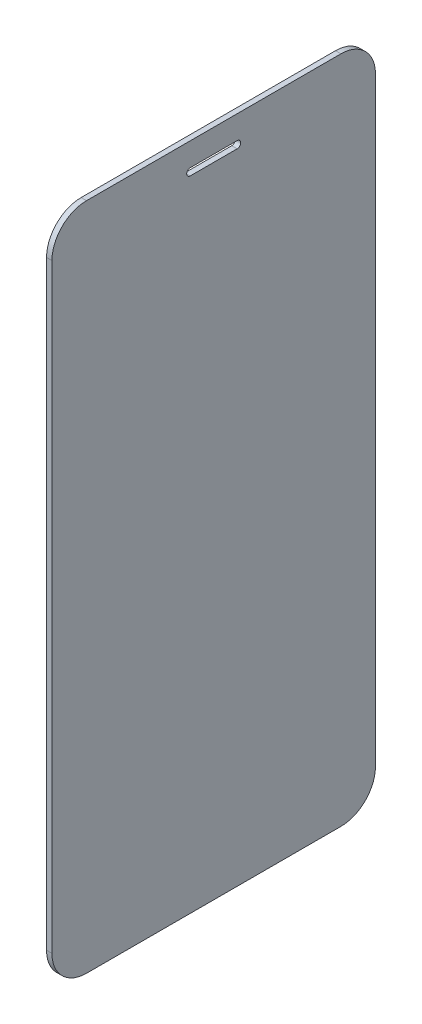
ISO-10303-21;
HEADER;
FILE_DESCRIPTION(('STEP AP214'),'2;1');
FILE_NAME('part.step','',(''),(''),'','','');
FILE_SCHEMA(('AUTOMOTIVE_DESIGN { 1 0 10303 214 1 1 1 1 }'));
ENDSEC;
DATA;
#1=APPLICATION_CONTEXT('core data for automotive mechanical design processes');
#2=APPLICATION_PROTOCOL_DEFINITION('international standard','automotive_design',2000,#1);
#3=PRODUCT_CONTEXT('',#1,'mechanical');
#4=PRODUCT('Part','Part','',(#3));
#5=PRODUCT_RELATED_PRODUCT_CATEGORY('part','',(#4));
#6=PRODUCT_DEFINITION_FORMATION('','',#4);
#7=PRODUCT_DEFINITION_CONTEXT('part definition',#1,'design');
#8=PRODUCT_DEFINITION('design','',#6,#7);
#9=PRODUCT_DEFINITION_SHAPE('','',#8);
#10=(LENGTH_UNIT() NAMED_UNIT(*) SI_UNIT(.MILLI.,.METRE.));
#11=(NAMED_UNIT(*) PLANE_ANGLE_UNIT() SI_UNIT($,.RADIAN.));
#12=(NAMED_UNIT(*) SI_UNIT($,.STERADIAN.) SOLID_ANGLE_UNIT());
#13=UNCERTAINTY_MEASURE_WITH_UNIT(LENGTH_MEASURE(1.E-05),#10,'distance_accuracy_value','');
#14=(GEOMETRIC_REPRESENTATION_CONTEXT(3) GLOBAL_UNCERTAINTY_ASSIGNED_CONTEXT((#13)) GLOBAL_UNIT_ASSIGNED_CONTEXT((#10,
#11,#12)) REPRESENTATION_CONTEXT('',''));
#15=CARTESIAN_POINT('',(0.,0.,0.));
#16=DIRECTION('',(0.,0.,1.));
#17=DIRECTION('',(1.,0.,0.));
#18=AXIS2_PLACEMENT_3D('',#15,#16,#17);
#19=CARTESIAN_POINT('',(3.8,-64.4349410542,31.1549410542));
#20=DIRECTION('',(1.,0.,0.));
#21=DIRECTION('',(0.,0.,-1.));
#22=AXIS2_PLACEMENT_3D('',#19,#20,#21);
#23=PLANE('',#22);
#24=CARTESIAN_POINT('',(3.8,56.98079434702,-4.345));
#25=DIRECTION('',(1.,0.,0.));
#26=DIRECTION('',(0.,0.,-1.));
#27=AXIS2_PLACEMENT_3D('',#24,#25,#26);
#28=CIRCLE('',#27,0.655000000000001);
#29=CARTESIAN_POINT('',(3.8,57.63579434702,-4.345));
#30=VERTEX_POINT('',#29);
#31=CARTESIAN_POINT('',(3.8,56.32579434702,-4.345));
#32=VERTEX_POINT('',#31);
#33=EDGE_CURVE('E205',#30,#32,#28,.F.);
#34=ORIENTED_EDGE('',*,*,#33,.T.);
#35=DIRECTION('',(0.,0.,1.));
#36=VECTOR('',#35,1.);
#37=CARTESIAN_POINT('',(3.8,56.32579434702,0.));
#38=LINE('',#37,#36);
#39=CARTESIAN_POINT('',(3.8,56.32579434702,4.345));
#40=VERTEX_POINT('',#39);
#41=EDGE_CURVE('E224',#32,#40,#38,.T.);
#42=ORIENTED_EDGE('',*,*,#41,.T.);
#43=CARTESIAN_POINT('',(3.8,56.98079434702,4.345));
#44=DIRECTION('',(1.,0.,0.));
#45=DIRECTION('',(0.,0.,-1.));
#46=AXIS2_PLACEMENT_3D('',#43,#44,#45);
#47=CIRCLE('',#46,0.654999999999999);
#48=CARTESIAN_POINT('',(3.8,57.63579434702,4.345));
#49=VERTEX_POINT('',#48);
#50=EDGE_CURVE('E145',#40,#49,#47,.F.);
#51=ORIENTED_EDGE('',*,*,#50,.T.);
#52=DIRECTION('',(0.,0.,-1.));
#53=VECTOR('',#52,1.);
#54=CARTESIAN_POINT('',(3.8,57.63579434702,0.));
#55=LINE('',#54,#53);
#56=EDGE_CURVE('E154',#49,#30,#55,.T.);
#57=ORIENTED_EDGE('',*,*,#56,.T.);
#58=EDGE_LOOP('',(#34,#42,#51,#57));
#59=FACE_BOUND('',#58,.T.);
#60=CARTESIAN_POINT('',(3.8,55.55,23.55));
#61=DIRECTION('',(1.,0.,0.));
#62=DIRECTION('',(0.,0.,-1.));
#63=AXIS2_PLACEMENT_3D('',#60,#61,#62);
#64=CIRCLE('',#63,6.40667409058);
#65=CARTESIAN_POINT('',(3.8,61.95667409058,23.55));
#66=VERTEX_POINT('',#65);
#67=CARTESIAN_POINT('',(3.8,55.55,29.95667409058));
#68=VERTEX_POINT('',#67);
#69=EDGE_CURVE('E213',#66,#68,#64,.T.);
#70=ORIENTED_EDGE('',*,*,#69,.T.);
#71=DIRECTION('',(0.,1.,0.));
#72=VECTOR('',#71,1.);
#73=CARTESIAN_POINT('',(3.8,0.,29.95667409058));
#74=LINE('',#73,#72);
#75=CARTESIAN_POINT('',(3.8,-55.55,29.95667409058));
#76=VERTEX_POINT('',#75);
#77=EDGE_CURVE('E160',#68,#76,#74,.F.);
#78=ORIENTED_EDGE('',*,*,#77,.T.);
#79=CARTESIAN_POINT('',(3.8,-55.55,23.55));
#80=DIRECTION('',(1.,0.,0.));
#81=DIRECTION('',(0.,0.,-1.));
#82=AXIS2_PLACEMENT_3D('',#79,#80,#81);
#83=CIRCLE('',#82,6.40667409058);
#84=CARTESIAN_POINT('',(3.8,-61.95667409058,23.55));
#85=VERTEX_POINT('',#84);
#86=EDGE_CURVE('E212',#76,#85,#83,.T.);
#87=ORIENTED_EDGE('',*,*,#86,.T.);
#88=DIRECTION('',(0.,0.,1.));
#89=VECTOR('',#88,1.);
#90=CARTESIAN_POINT('',(3.8,-61.95667409058,0.));
#91=LINE('',#90,#89);
#92=CARTESIAN_POINT('',(3.8,-61.95667409058,-23.55));
#93=VERTEX_POINT('',#92);
#94=EDGE_CURVE('E156',#85,#93,#91,.F.);
#95=ORIENTED_EDGE('',*,*,#94,.T.);
#96=CARTESIAN_POINT('',(3.8,-55.55,-23.55));
#97=DIRECTION('',(1.,0.,0.));
#98=DIRECTION('',(0.,0.,-1.));
#99=AXIS2_PLACEMENT_3D('',#96,#97,#98);
#100=CIRCLE('',#99,6.40667409057999);
#101=CARTESIAN_POINT('',(3.8,-55.55,-29.95667409058));
#102=VERTEX_POINT('',#101);
#103=EDGE_CURVE('E148',#93,#102,#100,.T.);
#104=ORIENTED_EDGE('',*,*,#103,.T.);
#105=DIRECTION('',(0.,-1.,0.));
#106=VECTOR('',#105,1.);
#107=CARTESIAN_POINT('',(3.8,0.,-29.95667409058));
#108=LINE('',#107,#106);
#109=CARTESIAN_POINT('',(3.8,55.55,-29.95667409058));
#110=VERTEX_POINT('',#109);
#111=EDGE_CURVE('E141',#102,#110,#108,.F.);
#112=ORIENTED_EDGE('',*,*,#111,.T.);
#113=CARTESIAN_POINT('',(3.8,55.55,-23.55));
#114=DIRECTION('',(1.,0.,0.));
#115=DIRECTION('',(0.,0.,-1.));
#116=AXIS2_PLACEMENT_3D('',#113,#114,#115);
#117=CIRCLE('',#116,6.40667409057999);
#118=CARTESIAN_POINT('',(3.8,61.95667409058,-23.55));
#119=VERTEX_POINT('',#118);
#120=EDGE_CURVE('E21',#110,#119,#117,.T.);
#121=ORIENTED_EDGE('',*,*,#120,.T.);
#122=DIRECTION('',(0.,0.,-1.));
#123=VECTOR('',#122,1.);
#124=CARTESIAN_POINT('',(3.8,61.95667409058,0.));
#125=LINE('',#124,#123);
#126=EDGE_CURVE('E164',#119,#66,#125,.F.);
#127=ORIENTED_EDGE('',*,*,#126,.T.);
#128=EDGE_LOOP('',(#70,#78,#87,#95,#104,#112,#121,#127));
#129=FACE_BOUND('',#128,.T.);
#130=ADVANCED_FACE('F17',(#59,#129),#23,.T.);
#131=CARTESIAN_POINT('',(3.5,55.7885136114,7.417330680812));
#132=DIRECTION('',(-1.,0.,0.));
#133=DIRECTION('',(0.,0.,1.));
#134=AXIS2_PLACEMENT_3D('',#131,#132,#133);
#135=PLANE('',#134);
#136=CARTESIAN_POINT('',(3.5,56.87963647909,7.937442161097));
#137=DIRECTION('',(-1.,0.,0.));
#138=DIRECTION('',(0.,-1.,0.));
#139=AXIS2_PLACEMENT_3D('',#136,#137,#138);
#140=CIRCLE('',#139,0.354941921672);
#141=CARTESIAN_POINT('',(3.5,56.524694557418,7.937442161097));
#142=VERTEX_POINT('',#141);
#143=EDGE_CURVE('E201',#142,#142,#140,.T.);
#144=ORIENTED_EDGE('',*,*,#143,.T.);
#145=EDGE_LOOP('',(#144));
#146=FACE_BOUND('',#145,.T.);
#147=ADVANCED_FACE('F317',(#146),#135,.T.);
#148=CARTESIAN_POINT('',(3.5,55.7885136114,7.417330680812));
#149=DIRECTION('',(-1.,0.,0.));
#150=DIRECTION('',(0.,0.,1.));
#151=AXIS2_PLACEMENT_3D('',#148,#149,#150);
#152=PLANE('',#151);
#153=CARTESIAN_POINT('',(3.5,56.87963647909,12.374216182));
#154=DIRECTION('',(-1.,0.,0.));
#155=DIRECTION('',(0.,-1.,0.));
#156=AXIS2_PLACEMENT_3D('',#153,#154,#155);
#157=CIRCLE('',#156,0.925953309070006);
#158=CARTESIAN_POINT('',(3.5,55.95368317002,12.374216182));
#159=VERTEX_POINT('',#158);
#160=EDGE_CURVE('E197',#159,#159,#157,.T.);
#161=ORIENTED_EDGE('',*,*,#160,.T.);
#162=EDGE_LOOP('',(#161));
#163=FACE_BOUND('',#162,.T.);
#164=ADVANCED_FACE('F323',(#163),#152,.T.);
#165=CARTESIAN_POINT('',(3.4,-50.5656,-30.16));
#166=DIRECTION('',(-1.,0.,0.));
#167=DIRECTION('',(0.,0.,1.));
#168=AXIS2_PLACEMENT_3D('',#165,#166,#167);
#169=PLANE('',#168);
#170=DIRECTION('',(0.,1.,0.));
#171=VECTOR('',#170,1.);
#172=CARTESIAN_POINT('',(3.4,1.58,29.));
#173=LINE('',#172,#171);
#174=CARTESIAN_POINT('',(3.4,-48.56,29.));
#175=VERTEX_POINT('',#174);
#176=CARTESIAN_POINT('',(3.4,51.72,29.));
#177=VERTEX_POINT('',#176);
#178=EDGE_CURVE('E271',#175,#177,#173,.T.);
#179=ORIENTED_EDGE('',*,*,#178,.T.);
#180=DIRECTION('',(0.,0.,-1.));
#181=VECTOR('',#180,1.);
#182=CARTESIAN_POINT('',(3.4,51.72,0.));
#183=LINE('',#182,#181);
#184=CARTESIAN_POINT('',(3.4,51.72,-29.));
#185=VERTEX_POINT('',#184);
#186=EDGE_CURVE('E267',#177,#185,#183,.T.);
#187=ORIENTED_EDGE('',*,*,#186,.T.);
#188=DIRECTION('',(0.,-1.,0.));
#189=VECTOR('',#188,1.);
#190=CARTESIAN_POINT('',(3.4,1.58,-29.));
#191=LINE('',#190,#189);
#192=CARTESIAN_POINT('',(3.4,-48.56,-29.));
#193=VERTEX_POINT('',#192);
#194=EDGE_CURVE('E200',#185,#193,#191,.T.);
#195=ORIENTED_EDGE('',*,*,#194,.T.);
#196=DIRECTION('',(0.,0.,1.));
#197=VECTOR('',#196,1.);
#198=CARTESIAN_POINT('',(3.4,-48.56,0.));
#199=LINE('',#198,#197);
#200=EDGE_CURVE('E276',#193,#175,#199,.T.);
#201=ORIENTED_EDGE('',*,*,#200,.T.);
#202=EDGE_LOOP('',(#179,#187,#195,#201));
#203=FACE_BOUND('',#202,.T.);
#204=ADVANCED_FACE('F283',(#203),#169,.T.);
#205=CARTESIAN_POINT('',(2.8,55.55,-23.55));
#206=DIRECTION('',(1.,0.,0.));
#207=DIRECTION('',(0.,0.,-1.));
#208=AXIS2_PLACEMENT_3D('',#205,#206,#207);
#209=CYLINDRICAL_SURFACE('',#208,6.40667409057999);
#210=ORIENTED_EDGE('',*,*,#120,.F.);
#211=DIRECTION('',(1.,0.,0.));
#212=VECTOR('',#211,1.);
#213=CARTESIAN_POINT('',(3.3,55.55,-29.95667409058));
#214=LINE('',#213,#212);
#215=CARTESIAN_POINT('',(2.8,55.55,-29.95667409058));
#216=VERTEX_POINT('',#215);
#217=EDGE_CURVE('E132',#110,#216,#214,.F.);
#218=ORIENTED_EDGE('',*,*,#217,.T.);
#219=CARTESIAN_POINT('',(2.8,55.55,-23.55));
#220=DIRECTION('',(1.,0.,0.));
#221=DIRECTION('',(0.,0.,-1.));
#222=AXIS2_PLACEMENT_3D('',#219,#220,#221);
#223=CIRCLE('',#222,6.40667409057999);
#224=CARTESIAN_POINT('',(2.8,61.95667409058,-23.55));
#225=VERTEX_POINT('',#224);
#226=EDGE_CURVE('E194',#216,#225,#223,.T.);
#227=ORIENTED_EDGE('',*,*,#226,.T.);
#228=DIRECTION('',(-1.,0.,0.));
#229=VECTOR('',#228,1.);
#230=CARTESIAN_POINT('',(3.3,61.95667409058,-23.55));
#231=LINE('',#230,#229);
#232=EDGE_CURVE('E134',#225,#119,#231,.F.);
#233=ORIENTED_EDGE('',*,*,#232,.T.);
#234=EDGE_LOOP('',(#210,#218,#227,#233));
#235=FACE_BOUND('',#234,.T.);
#236=ADVANCED_FACE('F130',(#235),#209,.T.);
#237=CARTESIAN_POINT('',(2.634830441386,61.95667409058,-24.492));
#238=DIRECTION('',(0.,1.,0.));
#239=DIRECTION('',(0.,0.,1.));
#240=AXIS2_PLACEMENT_3D('',#237,#238,#239);
#241=PLANE('',#240);
#242=ORIENTED_EDGE('',*,*,#126,.F.);
#243=ORIENTED_EDGE('',*,*,#232,.F.);
#244=DIRECTION('',(0.,0.,1.));
#245=VECTOR('',#244,1.);
#246=CARTESIAN_POINT('',(2.8,61.95667409058,0.));
#247=LINE('',#246,#245);
#248=CARTESIAN_POINT('',(2.8,61.95667409058,23.55));
#249=VERTEX_POINT('',#248);
#250=EDGE_CURVE('E193',#225,#249,#247,.T.);
#251=ORIENTED_EDGE('',*,*,#250,.T.);
#252=DIRECTION('',(1.,0.,0.));
#253=VECTOR('',#252,1.);
#254=CARTESIAN_POINT('',(3.3,61.95667409058,23.55));
#255=LINE('',#254,#253);
#256=EDGE_CURVE('E166',#249,#66,#255,.T.);
#257=ORIENTED_EDGE('',*,*,#256,.T.);
#258=EDGE_LOOP('',(#242,#243,#251,#257));
#259=FACE_BOUND('',#258,.T.);
#260=ADVANCED_FACE('F357',(#259),#241,.T.);
#261=CARTESIAN_POINT('',(2.8,55.55,23.55));
#262=DIRECTION('',(1.,0.,0.));
#263=DIRECTION('',(0.,0.,-1.));
#264=AXIS2_PLACEMENT_3D('',#261,#262,#263);
#265=CYLINDRICAL_SURFACE('',#264,6.40667409058);
#266=ORIENTED_EDGE('',*,*,#69,.F.);
#267=ORIENTED_EDGE('',*,*,#256,.F.);
#268=CARTESIAN_POINT('',(2.8,55.55,23.55));
#269=DIRECTION('',(1.,0.,0.));
#270=DIRECTION('',(0.,0.,-1.));
#271=AXIS2_PLACEMENT_3D('',#268,#269,#270);
#272=CIRCLE('',#271,6.40667409058);
#273=CARTESIAN_POINT('',(2.8,55.55,29.95667409058));
#274=VERTEX_POINT('',#273);
#275=EDGE_CURVE('E190',#249,#274,#272,.T.);
#276=ORIENTED_EDGE('',*,*,#275,.T.);
#277=DIRECTION('',(-1.,0.,0.));
#278=VECTOR('',#277,1.);
#279=CARTESIAN_POINT('',(3.3,55.55,29.95667409058));
#280=LINE('',#279,#278);
#281=EDGE_CURVE('E163',#274,#68,#280,.F.);
#282=ORIENTED_EDGE('',*,*,#281,.T.);
#283=EDGE_LOOP('',(#266,#267,#276,#282));
#284=FACE_BOUND('',#283,.T.);
#285=ADVANCED_FACE('F356',(#284),#265,.T.);
#286=CARTESIAN_POINT('',(2.634830441386,57.772,29.95667409058));
#287=DIRECTION('',(0.,0.,1.));
#288=DIRECTION('',(0.,-1.,0.));
#289=AXIS2_PLACEMENT_3D('',#286,#287,#288);
#290=PLANE('',#289);
#291=ORIENTED_EDGE('',*,*,#77,.F.);
#292=ORIENTED_EDGE('',*,*,#281,.F.);
#293=DIRECTION('',(0.,-1.,0.));
#294=VECTOR('',#293,1.);
#295=CARTESIAN_POINT('',(2.8,0.,29.95667409058));
#296=LINE('',#295,#294);
#297=CARTESIAN_POINT('',(2.8,-55.55,29.95667409058));
#298=VERTEX_POINT('',#297);
#299=EDGE_CURVE('E189',#274,#298,#296,.T.);
#300=ORIENTED_EDGE('',*,*,#299,.T.);
#301=DIRECTION('',(1.,0.,0.));
#302=VECTOR('',#301,1.);
#303=CARTESIAN_POINT('',(3.3,-55.55,29.95667409058));
#304=LINE('',#303,#302);
#305=EDGE_CURVE('E162',#298,#76,#304,.T.);
#306=ORIENTED_EDGE('',*,*,#305,.T.);
#307=EDGE_LOOP('',(#291,#292,#300,#306));
#308=FACE_BOUND('',#307,.T.);
#309=ADVANCED_FACE('F247',(#308),#290,.T.);
#310=CARTESIAN_POINT('',(2.8,-55.55,23.55));
#311=DIRECTION('',(1.,0.,0.));
#312=DIRECTION('',(0.,0.,-1.));
#313=AXIS2_PLACEMENT_3D('',#310,#311,#312);
#314=CYLINDRICAL_SURFACE('',#313,6.40667409058);
#315=ORIENTED_EDGE('',*,*,#86,.F.);
#316=ORIENTED_EDGE('',*,*,#305,.F.);
#317=CARTESIAN_POINT('',(2.8,-55.55,23.55));
#318=DIRECTION('',(1.,0.,0.));
#319=DIRECTION('',(0.,0.,-1.));
#320=AXIS2_PLACEMENT_3D('',#317,#318,#319);
#321=CIRCLE('',#320,6.40667409058);
#322=CARTESIAN_POINT('',(2.8,-61.95667409058,23.55));
#323=VERTEX_POINT('',#322);
#324=EDGE_CURVE('E186',#298,#323,#321,.T.);
#325=ORIENTED_EDGE('',*,*,#324,.T.);
#326=DIRECTION('',(-1.,0.,0.));
#327=VECTOR('',#326,1.);
#328=CARTESIAN_POINT('',(3.3,-61.95667409058,23.55));
#329=LINE('',#328,#327);
#330=EDGE_CURVE('E159',#323,#85,#329,.F.);
#331=ORIENTED_EDGE('',*,*,#330,.T.);
#332=EDGE_LOOP('',(#315,#316,#325,#331));
#333=FACE_BOUND('',#332,.T.);
#334=ADVANCED_FACE('F252',(#333),#314,.T.);
#335=CARTESIAN_POINT('',(2.634830441386,-61.95667409058,24.492));
#336=DIRECTION('',(0.,-1.,0.));
#337=DIRECTION('',(0.,0.,-1.));
#338=AXIS2_PLACEMENT_3D('',#335,#336,#337);
#339=PLANE('',#338);
#340=ORIENTED_EDGE('',*,*,#94,.F.);
#341=ORIENTED_EDGE('',*,*,#330,.F.);
#342=DIRECTION('',(0.,0.,-1.));
#343=VECTOR('',#342,1.);
#344=CARTESIAN_POINT('',(2.8,-61.95667409058,0.));
#345=LINE('',#344,#343);
#346=CARTESIAN_POINT('',(2.8,-61.95667409058,-23.55));
#347=VERTEX_POINT('',#346);
#348=EDGE_CURVE('E185',#323,#347,#345,.T.);
#349=ORIENTED_EDGE('',*,*,#348,.T.);
#350=DIRECTION('',(1.,0.,0.));
#351=VECTOR('',#350,1.);
#352=CARTESIAN_POINT('',(3.3,-61.95667409058,-23.55));
#353=LINE('',#352,#351);
#354=EDGE_CURVE('E158',#347,#93,#353,.T.);
#355=ORIENTED_EDGE('',*,*,#354,.T.);
#356=EDGE_LOOP('',(#340,#341,#349,#355));
#357=FACE_BOUND('',#356,.T.);
#358=ADVANCED_FACE('F351',(#357),#339,.T.);
#359=CARTESIAN_POINT('',(2.8,-55.55,-23.55));
#360=DIRECTION('',(1.,0.,0.));
#361=DIRECTION('',(0.,0.,-1.));
#362=AXIS2_PLACEMENT_3D('',#359,#360,#361);
#363=CYLINDRICAL_SURFACE('',#362,6.40667409057999);
#364=ORIENTED_EDGE('',*,*,#103,.F.);
#365=ORIENTED_EDGE('',*,*,#354,.F.);
#366=CARTESIAN_POINT('',(2.8,-55.55,-23.55));
#367=DIRECTION('',(1.,0.,0.));
#368=DIRECTION('',(0.,0.,-1.));
#369=AXIS2_PLACEMENT_3D('',#366,#367,#368);
#370=CIRCLE('',#369,6.40667409057999);
#371=CARTESIAN_POINT('',(2.8,-55.55,-29.95667409058));
#372=VERTEX_POINT('',#371);
#373=EDGE_CURVE('E182',#347,#372,#370,.T.);
#374=ORIENTED_EDGE('',*,*,#373,.T.);
#375=DIRECTION('',(-1.,0.,0.));
#376=VECTOR('',#375,1.);
#377=CARTESIAN_POINT('',(3.3,-55.55,-29.95667409058));
#378=LINE('',#377,#376);
#379=EDGE_CURVE('E149',#372,#102,#378,.F.);
#380=ORIENTED_EDGE('',*,*,#379,.T.);
#381=EDGE_LOOP('',(#364,#365,#374,#380));
#382=FACE_BOUND('',#381,.T.);
#383=ADVANCED_FACE('F350',(#382),#363,.T.);
#384=CARTESIAN_POINT('',(2.634830441386,-57.772,-29.95667409058));
#385=DIRECTION('',(0.,0.,-1.));
#386=DIRECTION('',(0.,1.,0.));
#387=AXIS2_PLACEMENT_3D('',#384,#385,#386);
#388=PLANE('',#387);
#389=ORIENTED_EDGE('',*,*,#111,.F.);
#390=ORIENTED_EDGE('',*,*,#379,.F.);
#391=DIRECTION('',(0.,1.,0.));
#392=VECTOR('',#391,1.);
#393=CARTESIAN_POINT('',(2.8,0.,-29.95667409058));
#394=LINE('',#393,#392);
#395=EDGE_CURVE('E144',#372,#216,#394,.T.);
#396=ORIENTED_EDGE('',*,*,#395,.T.);
#397=ORIENTED_EDGE('',*,*,#217,.F.);
#398=EDGE_LOOP('',(#389,#390,#396,#397));
#399=FACE_BOUND('',#398,.T.);
#400=ADVANCED_FACE('F140',(#399),#388,.T.);
#401=CARTESIAN_POINT('',(2.8,56.98079434702,4.345));
#402=DIRECTION('',(1.,0.,0.));
#403=DIRECTION('',(0.,0.,-1.));
#404=AXIS2_PLACEMENT_3D('',#401,#402,#403);
#405=CYLINDRICAL_SURFACE('',#404,0.654999999999999);
#406=ORIENTED_EDGE('',*,*,#50,.F.);
#407=DIRECTION('',(-1.,0.,0.));
#408=VECTOR('',#407,1.);
#409=CARTESIAN_POINT('',(3.3,56.32579434702,4.345));
#410=LINE('',#409,#408);
#411=CARTESIAN_POINT('',(2.8,56.32579434702,4.345));
#412=VERTEX_POINT('',#411);
#413=EDGE_CURVE('E204',#40,#412,#410,.T.);
#414=ORIENTED_EDGE('',*,*,#413,.T.);
#415=CARTESIAN_POINT('',(2.8,56.98079434702,4.345));
#416=DIRECTION('',(1.,0.,0.));
#417=DIRECTION('',(0.,0.,-1.));
#418=AXIS2_PLACEMENT_3D('',#415,#416,#417);
#419=CIRCLE('',#418,0.654999999999999);
#420=CARTESIAN_POINT('',(2.8,57.63579434702,4.345));
#421=VERTEX_POINT('',#420);
#422=EDGE_CURVE('E179',#412,#421,#419,.F.);
#423=ORIENTED_EDGE('',*,*,#422,.T.);
#424=DIRECTION('',(1.,0.,0.));
#425=VECTOR('',#424,1.);
#426=CARTESIAN_POINT('',(3.3,57.63579434702,4.345));
#427=LINE('',#426,#425);
#428=EDGE_CURVE('E210',#421,#49,#427,.T.);
#429=ORIENTED_EDGE('',*,*,#428,.T.);
#430=EDGE_LOOP('',(#406,#414,#423,#429));
#431=FACE_BOUND('',#430,.T.);
#432=ADVANCED_FACE('F311',(#431),#405,.F.);
#433=CARTESIAN_POINT('',(2.634830441386,57.63579434702,-4.5188));
#434=DIRECTION('',(0.,1.,0.));
#435=DIRECTION('',(0.,0.,1.));
#436=AXIS2_PLACEMENT_3D('',#433,#434,#435);
#437=PLANE('',#436);
#438=ORIENTED_EDGE('',*,*,#56,.F.);
#439=ORIENTED_EDGE('',*,*,#428,.F.);
#440=DIRECTION('',(0.,0.,-1.));
#441=VECTOR('',#440,1.);
#442=CARTESIAN_POINT('',(2.8,57.63579434702,0.));
#443=LINE('',#442,#441);
#444=CARTESIAN_POINT('',(2.8,57.63579434702,-4.345));
#445=VERTEX_POINT('',#444);
#446=EDGE_CURVE('E178',#421,#445,#443,.T.);
#447=ORIENTED_EDGE('',*,*,#446,.T.);
#448=DIRECTION('',(-1.,0.,0.));
#449=VECTOR('',#448,1.);
#450=CARTESIAN_POINT('',(3.3,57.63579434702,-4.34500000000001));
#451=LINE('',#450,#449);
#452=EDGE_CURVE('E208',#445,#30,#451,.F.);
#453=ORIENTED_EDGE('',*,*,#452,.T.);
#454=EDGE_LOOP('',(#438,#439,#447,#453));
#455=FACE_BOUND('',#454,.T.);
#456=ADVANCED_FACE('F306',(#455),#437,.F.);
#457=CARTESIAN_POINT('',(2.8,56.98079434702,-4.345));
#458=DIRECTION('',(1.,0.,0.));
#459=DIRECTION('',(0.,0.,-1.));
#460=AXIS2_PLACEMENT_3D('',#457,#458,#459);
#461=CYLINDRICAL_SURFACE('',#460,0.655000000000001);
#462=ORIENTED_EDGE('',*,*,#33,.F.);
#463=ORIENTED_EDGE('',*,*,#452,.F.);
#464=CARTESIAN_POINT('',(2.8,56.98079434702,-4.345));
#465=DIRECTION('',(1.,0.,0.));
#466=DIRECTION('',(0.,0.,-1.));
#467=AXIS2_PLACEMENT_3D('',#464,#465,#466);
#468=CIRCLE('',#467,0.655000000000001);
#469=CARTESIAN_POINT('',(2.8,56.32579434702,-4.345));
#470=VERTEX_POINT('',#469);
#471=EDGE_CURVE('E175',#445,#470,#468,.F.);
#472=ORIENTED_EDGE('',*,*,#471,.T.);
#473=DIRECTION('',(1.,0.,0.));
#474=VECTOR('',#473,1.);
#475=CARTESIAN_POINT('',(3.3,56.32579434702,-4.345));
#476=LINE('',#475,#474);
#477=EDGE_CURVE('E207',#470,#32,#476,.T.);
#478=ORIENTED_EDGE('',*,*,#477,.T.);
#479=EDGE_LOOP('',(#462,#463,#472,#478));
#480=FACE_BOUND('',#479,.T.);
#481=ADVANCED_FACE('F315',(#480),#461,.F.);
#482=CARTESIAN_POINT('',(2.634830441386,56.32579434702,4.5188));
#483=DIRECTION('',(0.,-1.,0.));
#484=DIRECTION('',(0.,0.,-1.));
#485=AXIS2_PLACEMENT_3D('',#482,#483,#484);
#486=PLANE('',#485);
#487=ORIENTED_EDGE('',*,*,#41,.F.);
#488=ORIENTED_EDGE('',*,*,#477,.F.);
#489=DIRECTION('',(0.,0.,1.));
#490=VECTOR('',#489,1.);
#491=CARTESIAN_POINT('',(2.8,56.32579434702,0.));
#492=LINE('',#491,#490);
#493=EDGE_CURVE('E174',#470,#412,#492,.T.);
#494=ORIENTED_EDGE('',*,*,#493,.T.);
#495=ORIENTED_EDGE('',*,*,#413,.F.);
#496=EDGE_LOOP('',(#487,#488,#494,#495));
#497=FACE_BOUND('',#496,.T.);
#498=ADVANCED_FACE('F314',(#497),#486,.F.);
#499=CARTESIAN_POINT('',(3.5,56.87963647909,7.937442161097));
#500=DIRECTION('',(-1.,0.,0.));
#501=DIRECTION('',(0.,-1.,0.));
#502=AXIS2_PLACEMENT_3D('',#499,#500,#501);
#503=CYLINDRICAL_SURFACE('',#502,0.354941921672);
#504=ORIENTED_EDGE('',*,*,#143,.F.);
#505=EDGE_LOOP('',(#504));
#506=FACE_BOUND('',#505,.T.);
#507=CARTESIAN_POINT('',(2.8,56.87963647909,7.937442161097));
#508=DIRECTION('',(-1.,0.,0.));
#509=DIRECTION('',(0.,-1.,0.));
#510=AXIS2_PLACEMENT_3D('',#507,#508,#509);
#511=CIRCLE('',#510,0.354941921672);
#512=CARTESIAN_POINT('',(2.8,56.524694557418,7.937442161097));
#513=VERTEX_POINT('',#512);
#514=EDGE_CURVE('E171',#513,#513,#511,.T.);
#515=ORIENTED_EDGE('',*,*,#514,.T.);
#516=EDGE_LOOP('',(#515));
#517=FACE_BOUND('',#516,.T.);
#518=ADVANCED_FACE('F345',(#506,#517),#503,.F.);
#519=CARTESIAN_POINT('',(3.5,56.87963647909,12.374216182));
#520=DIRECTION('',(-1.,0.,0.));
#521=DIRECTION('',(0.,-1.,0.));
#522=AXIS2_PLACEMENT_3D('',#519,#520,#521);
#523=CYLINDRICAL_SURFACE('',#522,0.925953309070006);
#524=ORIENTED_EDGE('',*,*,#160,.F.);
#525=EDGE_LOOP('',(#524));
#526=FACE_BOUND('',#525,.T.);
#527=CARTESIAN_POINT('',(2.8,56.87963647909,12.374216182));
#528=DIRECTION('',(-1.,0.,0.));
#529=DIRECTION('',(0.,-1.,0.));
#530=AXIS2_PLACEMENT_3D('',#527,#528,#529);
#531=CIRCLE('',#530,0.925953309070006);
#532=CARTESIAN_POINT('',(2.8,55.95368317002,12.374216182));
#533=VERTEX_POINT('',#532);
#534=EDGE_CURVE('E167',#533,#533,#531,.T.);
#535=ORIENTED_EDGE('',*,*,#534,.T.);
#536=EDGE_LOOP('',(#535));
#537=FACE_BOUND('',#536,.T.);
#538=ADVANCED_FACE('F342',(#526,#537),#523,.F.);
#539=CARTESIAN_POINT('',(3.565169558614,53.7256,-29.));
#540=DIRECTION('',(0.,0.,-1.));
#541=DIRECTION('',(0.,-1.,0.));
#542=AXIS2_PLACEMENT_3D('',#539,#540,#541);
#543=PLANE('',#542);
#544=ORIENTED_EDGE('',*,*,#194,.F.);
#545=DIRECTION('',(-1.,0.,0.));
#546=VECTOR('',#545,1.);
#547=CARTESIAN_POINT('',(3.1,51.72,-29.));
#548=LINE('',#547,#546);
#549=CARTESIAN_POINT('',(2.8,51.72,-29.));
#550=VERTEX_POINT('',#549);
#551=EDGE_CURVE('E196',#185,#550,#548,.T.);
#552=ORIENTED_EDGE('',*,*,#551,.T.);
#553=DIRECTION('',(0.,-1.,0.));
#554=VECTOR('',#553,1.);
#555=CARTESIAN_POINT('',(2.8,0.,-29.));
#556=LINE('',#555,#554);
#557=CARTESIAN_POINT('',(2.8,-48.56,-29.));
#558=VERTEX_POINT('',#557);
#559=EDGE_CURVE('E170',#550,#558,#556,.T.);
#560=ORIENTED_EDGE('',*,*,#559,.T.);
#561=DIRECTION('',(1.,0.,0.));
#562=VECTOR('',#561,1.);
#563=CARTESIAN_POINT('',(3.1,-48.56,-29.));
#564=LINE('',#563,#562);
#565=EDGE_CURVE('E277',#558,#193,#564,.T.);
#566=ORIENTED_EDGE('',*,*,#565,.T.);
#567=EDGE_LOOP('',(#544,#552,#560,#566));
#568=FACE_BOUND('',#567,.T.);
#569=ADVANCED_FACE('F339',(#568),#543,.F.);
#570=CARTESIAN_POINT('',(3.565169558614,-48.56,-30.16));
#571=DIRECTION('',(0.,-1.,0.));
#572=DIRECTION('',(0.,0.,1.));
#573=AXIS2_PLACEMENT_3D('',#570,#571,#572);
#574=PLANE('',#573);
#575=ORIENTED_EDGE('',*,*,#200,.F.);
#576=ORIENTED_EDGE('',*,*,#565,.F.);
#577=DIRECTION('',(0.,0.,1.));
#578=VECTOR('',#577,1.);
#579=CARTESIAN_POINT('',(2.8,-48.56,0.));
#580=LINE('',#579,#578);
#581=CARTESIAN_POINT('',(2.8,-48.56,29.));
#582=VERTEX_POINT('',#581);
#583=EDGE_CURVE('E290',#558,#582,#580,.T.);
#584=ORIENTED_EDGE('',*,*,#583,.T.);
#585=DIRECTION('',(1.,0.,0.));
#586=VECTOR('',#585,1.);
#587=CARTESIAN_POINT('',(3.1,-48.56,29.));
#588=LINE('',#587,#586);
#589=EDGE_CURVE('E273',#582,#175,#588,.T.);
#590=ORIENTED_EDGE('',*,*,#589,.T.);
#591=EDGE_LOOP('',(#575,#576,#584,#590));
#592=FACE_BOUND('',#591,.T.);
#593=ADVANCED_FACE('F287',(#592),#574,.F.);
#594=CARTESIAN_POINT('',(3.565169558614,-50.5656,29.));
#595=DIRECTION('',(0.,0.,1.));
#596=DIRECTION('',(0.,1.,0.));
#597=AXIS2_PLACEMENT_3D('',#594,#595,#596);
#598=PLANE('',#597);
#599=ORIENTED_EDGE('',*,*,#178,.F.);
#600=ORIENTED_EDGE('',*,*,#589,.F.);
#601=DIRECTION('',(0.,1.,0.));
#602=VECTOR('',#601,1.);
#603=CARTESIAN_POINT('',(2.8,0.,29.));
#604=LINE('',#603,#602);
#605=CARTESIAN_POINT('',(2.8,51.72,29.));
#606=VERTEX_POINT('',#605);
#607=EDGE_CURVE('E27',#582,#606,#604,.T.);
#608=ORIENTED_EDGE('',*,*,#607,.T.);
#609=DIRECTION('',(1.,0.,0.));
#610=VECTOR('',#609,1.);
#611=CARTESIAN_POINT('',(3.1,51.72,29.));
#612=LINE('',#611,#610);
#613=EDGE_CURVE('E35',#606,#177,#612,.T.);
#614=ORIENTED_EDGE('',*,*,#613,.T.);
#615=EDGE_LOOP('',(#599,#600,#608,#614));
#616=FACE_BOUND('',#615,.T.);
#617=ADVANCED_FACE('F294',(#616),#598,.F.);
#618=CARTESIAN_POINT('',(3.565169558614,51.72,30.16));
#619=DIRECTION('',(0.,1.,0.));
#620=DIRECTION('',(0.,0.,-1.));
#621=AXIS2_PLACEMENT_3D('',#618,#619,#620);
#622=PLANE('',#621);
#623=ORIENTED_EDGE('',*,*,#186,.F.);
#624=ORIENTED_EDGE('',*,*,#613,.F.);
#625=DIRECTION('',(0.,0.,-1.));
#626=VECTOR('',#625,1.);
#627=CARTESIAN_POINT('',(2.8,51.72,0.));
#628=LINE('',#627,#626);
#629=EDGE_CURVE('E11',#606,#550,#628,.T.);
#630=ORIENTED_EDGE('',*,*,#629,.T.);
#631=ORIENTED_EDGE('',*,*,#551,.F.);
#632=EDGE_LOOP('',(#623,#624,#630,#631));
#633=FACE_BOUND('',#632,.T.);
#634=ADVANCED_FACE('F328',(#633),#622,.F.);
#635=CARTESIAN_POINT('',(2.8,-64.4349410542,31.1549410542));
#636=DIRECTION('',(1.,0.,0.));
#637=DIRECTION('',(0.,0.,-1.));
#638=AXIS2_PLACEMENT_3D('',#635,#636,#637);
#639=PLANE('',#638);
#640=ORIENTED_EDGE('',*,*,#607,.F.);
#641=ORIENTED_EDGE('',*,*,#583,.F.);
#642=ORIENTED_EDGE('',*,*,#559,.F.);
#643=ORIENTED_EDGE('',*,*,#629,.F.);
#644=EDGE_LOOP('',(#640,#641,#642,#643));
#645=FACE_BOUND('',#644,.T.);
#646=ORIENTED_EDGE('',*,*,#534,.F.);
#647=EDGE_LOOP('',(#646));
#648=FACE_BOUND('',#647,.T.);
#649=ORIENTED_EDGE('',*,*,#514,.F.);
#650=EDGE_LOOP('',(#649));
#651=FACE_BOUND('',#650,.T.);
#652=ORIENTED_EDGE('',*,*,#471,.F.);
#653=ORIENTED_EDGE('',*,*,#446,.F.);
#654=ORIENTED_EDGE('',*,*,#422,.F.);
#655=ORIENTED_EDGE('',*,*,#493,.F.);
#656=EDGE_LOOP('',(#652,#653,#654,#655));
#657=FACE_BOUND('',#656,.T.);
#658=ORIENTED_EDGE('',*,*,#373,.F.);
#659=ORIENTED_EDGE('',*,*,#348,.F.);
#660=ORIENTED_EDGE('',*,*,#324,.F.);
#661=ORIENTED_EDGE('',*,*,#299,.F.);
#662=ORIENTED_EDGE('',*,*,#275,.F.);
#663=ORIENTED_EDGE('',*,*,#250,.F.);
#664=ORIENTED_EDGE('',*,*,#226,.F.);
#665=ORIENTED_EDGE('',*,*,#395,.F.);
#666=EDGE_LOOP('',(#658,#659,#660,#661,#662,#663,#664,#665));
#667=FACE_BOUND('',#666,.T.);
#668=ADVANCED_FACE('F19',(#645,#648,#651,#657,#667),#639,.F.);
#669=CLOSED_SHELL('',(#130,#147,#164,#204,#236,#260,#285,#309,#334,#358,#383,#400,#432,#456,
#481,#498,#518,#538,#569,#593,#617,#634,#668));
#670=MANIFOLD_SOLID_BREP('B1',#669);
#671=ADVANCED_BREP_SHAPE_REPRESENTATION('',(#18,#670),#14);
#672=SHAPE_DEFINITION_REPRESENTATION(#9,#671);
ENDSEC;
END-ISO-10303-21;
